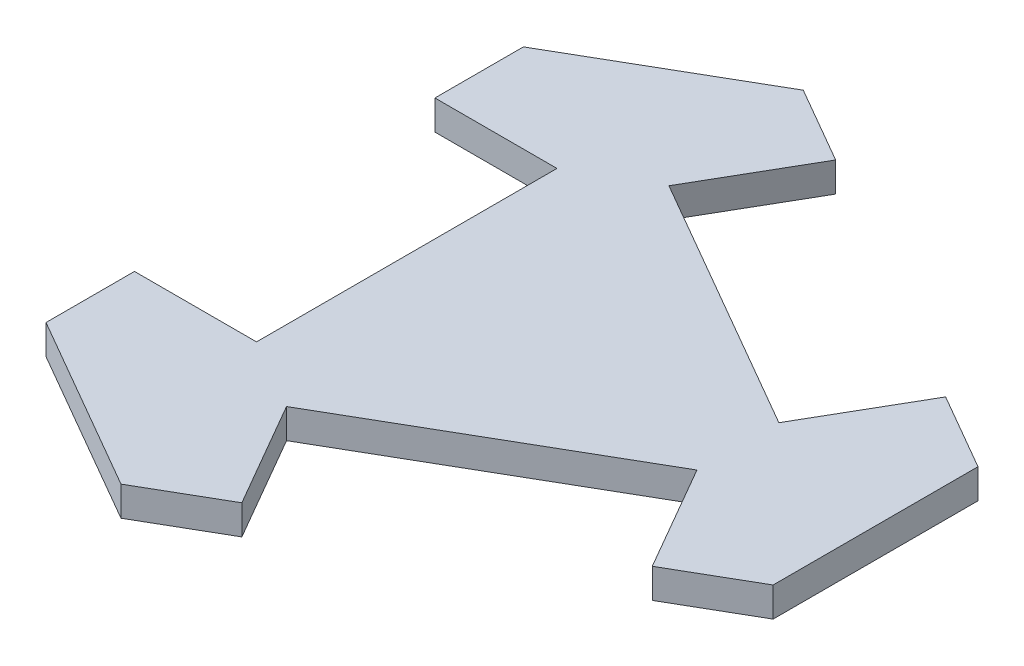
ISO-10303-21;
HEADER;
FILE_DESCRIPTION(('STEP AP214'),'2;1');
FILE_NAME('part.step','',(''),(''),'','','');
FILE_SCHEMA(('AUTOMOTIVE_DESIGN { 1 0 10303 214 1 1 1 1 }'));
ENDSEC;
DATA;
#1=APPLICATION_CONTEXT('core data for automotive mechanical design processes');
#2=APPLICATION_PROTOCOL_DEFINITION('international standard','automotive_design',2000,#1);
#3=PRODUCT_CONTEXT('',#1,'mechanical');
#4=PRODUCT('Part','Part','',(#3));
#5=PRODUCT_RELATED_PRODUCT_CATEGORY('part','',(#4));
#6=PRODUCT_DEFINITION_FORMATION('','',#4);
#7=PRODUCT_DEFINITION_CONTEXT('part definition',#1,'design');
#8=PRODUCT_DEFINITION('design','',#6,#7);
#9=PRODUCT_DEFINITION_SHAPE('','',#8);
#10=(LENGTH_UNIT() NAMED_UNIT(*) SI_UNIT(.MILLI.,.METRE.));
#11=(NAMED_UNIT(*) PLANE_ANGLE_UNIT() SI_UNIT($,.RADIAN.));
#12=(NAMED_UNIT(*) SI_UNIT($,.STERADIAN.) SOLID_ANGLE_UNIT());
#13=UNCERTAINTY_MEASURE_WITH_UNIT(LENGTH_MEASURE(1.E-05),#10,'distance_accuracy_value','');
#14=(GEOMETRIC_REPRESENTATION_CONTEXT(3) GLOBAL_UNCERTAINTY_ASSIGNED_CONTEXT((#13)) GLOBAL_UNIT_ASSIGNED_CONTEXT((#10,
#11,#12)) REPRESENTATION_CONTEXT('',''));
#15=CARTESIAN_POINT('',(0.,0.,0.));
#16=DIRECTION('',(0.,0.,1.));
#17=DIRECTION('',(1.,0.,0.));
#18=AXIS2_PLACEMENT_3D('',#15,#16,#17);
#19=CARTESIAN_POINT('',(-86.6025403784434,10.,-80.7179676972441));
#20=DIRECTION('',(1.,0.,0.));
#21=DIRECTION('',(0.,0.,-1.));
#22=AXIS2_PLACEMENT_3D('',#19,#20,#21);
#23=PLANE('',#22);
#24=DIRECTION('',(0.,0.,1.));
#25=VECTOR('',#24,1.);
#26=CARTESIAN_POINT('',(-86.6025403784434,0.,-80.7179676972441));
#27=LINE('',#26,#25);
#28=CARTESIAN_POINT('',(-86.6025403784434,0.,-80.7179676972441));
#29=VERTEX_POINT('',#28);
#30=CARTESIAN_POINT('',(-86.6025403784434,0.,-50.8));
#31=VERTEX_POINT('',#30);
#32=EDGE_CURVE('E206',#29,#31,#27,.T.);
#33=ORIENTED_EDGE('',*,*,#32,.T.);
#34=DIRECTION('',(0.,-1.,0.));
#35=VECTOR('',#34,1.);
#36=CARTESIAN_POINT('',(-86.6025403784434,10.,-50.8));
#37=LINE('',#36,#35);
#38=CARTESIAN_POINT('',(-86.6025403784434,10.,-50.8));
#39=VERTEX_POINT('',#38);
#40=EDGE_CURVE('E11',#39,#31,#37,.T.);
#41=ORIENTED_EDGE('',*,*,#40,.F.);
#42=DIRECTION('',(0.,0.,1.));
#43=VECTOR('',#42,1.);
#44=CARTESIAN_POINT('',(-86.6025403784434,10.,-80.7179676972441));
#45=LINE('',#44,#43);
#46=CARTESIAN_POINT('',(-86.6025403784434,10.,-80.7179676972441));
#47=VERTEX_POINT('',#46);
#48=EDGE_CURVE('E258',#47,#39,#45,.T.);
#49=ORIENTED_EDGE('',*,*,#48,.F.);
#50=DIRECTION('',(0.,-1.,0.));
#51=VECTOR('',#50,1.);
#52=CARTESIAN_POINT('',(-86.6025403784434,10.,-80.7179676972441));
#53=LINE('',#52,#51);
#54=EDGE_CURVE('E202',#47,#29,#53,.T.);
#55=ORIENTED_EDGE('',*,*,#54,.T.);
#56=EDGE_LOOP('',(#33,#41,#49,#55));
#57=FACE_BOUND('',#56,.T.);
#58=ADVANCED_FACE('F45',(#57),#23,.F.);
#59=CARTESIAN_POINT('',(-45.3275403784432,10.,-50.8));
#60=DIRECTION('',(0.,0.,-1.));
#61=DIRECTION('',(-1.,0.,0.));
#62=AXIS2_PLACEMENT_3D('',#59,#60,#61);
#63=PLANE('',#62);
#64=DIRECTION('',(1.,0.,0.));
#65=VECTOR('',#64,1.);
#66=CARTESIAN_POINT('',(-45.3275403784432,0.,-50.8));
#67=LINE('',#66,#65);
#68=CARTESIAN_POINT('',(-45.3275403784432,0.,-50.8));
#69=VERTEX_POINT('',#68);
#70=EDGE_CURVE('E210',#31,#69,#67,.T.);
#71=ORIENTED_EDGE('',*,*,#70,.T.);
#72=DIRECTION('',(0.,-1.,0.));
#73=VECTOR('',#72,1.);
#74=CARTESIAN_POINT('',(-45.3275403784432,10.,-50.8));
#75=LINE('',#74,#73);
#76=CARTESIAN_POINT('',(-45.3275403784432,10.,-50.8));
#77=VERTEX_POINT('',#76);
#78=EDGE_CURVE('E54',#77,#69,#75,.T.);
#79=ORIENTED_EDGE('',*,*,#78,.F.);
#80=DIRECTION('',(1.,0.,0.));
#81=VECTOR('',#80,1.);
#82=CARTESIAN_POINT('',(-45.3275403784432,10.,-50.8));
#83=LINE('',#82,#81);
#84=EDGE_CURVE('E135',#39,#77,#83,.T.);
#85=ORIENTED_EDGE('',*,*,#84,.F.);
#86=ORIENTED_EDGE('',*,*,#40,.T.);
#87=EDGE_LOOP('',(#71,#79,#85,#86));
#88=FACE_BOUND('',#87,.T.);
#89=ADVANCED_FACE('F394',(#88),#63,.F.);
#90=CARTESIAN_POINT('',(-45.3275403784432,10.,50.8));
#91=DIRECTION('',(1.,0.,0.));
#92=DIRECTION('',(0.,0.,-1.));
#93=AXIS2_PLACEMENT_3D('',#90,#91,#92);
#94=PLANE('',#93);
#95=DIRECTION('',(0.,0.,1.));
#96=VECTOR('',#95,1.);
#97=CARTESIAN_POINT('',(-45.3275403784432,0.,50.8));
#98=LINE('',#97,#96);
#99=CARTESIAN_POINT('',(-45.3275403784432,0.,50.8));
#100=VERTEX_POINT('',#99);
#101=EDGE_CURVE('E213',#69,#100,#98,.T.);
#102=ORIENTED_EDGE('',*,*,#101,.T.);
#103=DIRECTION('',(0.,-1.,0.));
#104=VECTOR('',#103,1.);
#105=CARTESIAN_POINT('',(-45.3275403784432,10.,50.8));
#106=LINE('',#105,#104);
#107=CARTESIAN_POINT('',(-45.3275403784432,10.,50.8));
#108=VERTEX_POINT('',#107);
#109=EDGE_CURVE('E309',#108,#100,#106,.T.);
#110=ORIENTED_EDGE('',*,*,#109,.F.);
#111=DIRECTION('',(0.,0.,1.));
#112=VECTOR('',#111,1.);
#113=CARTESIAN_POINT('',(-45.3275403784432,10.,50.8));
#114=LINE('',#113,#112);
#115=EDGE_CURVE('E319',#77,#108,#114,.T.);
#116=ORIENTED_EDGE('',*,*,#115,.F.);
#117=ORIENTED_EDGE('',*,*,#78,.T.);
#118=EDGE_LOOP('',(#102,#110,#116,#117));
#119=FACE_BOUND('',#118,.T.);
#120=ADVANCED_FACE('F317',(#119),#94,.F.);
#121=CARTESIAN_POINT('',(-45.3275403784432,10.,50.8));
#122=DIRECTION('',(0.,0.,1.));
#123=DIRECTION('',(1.,0.,0.));
#124=AXIS2_PLACEMENT_3D('',#121,#122,#123);
#125=PLANE('',#124);
#126=DIRECTION('',(-1.,0.,0.));
#127=VECTOR('',#126,1.);
#128=CARTESIAN_POINT('',(-45.3275403784432,0.,50.8));
#129=LINE('',#128,#127);
#130=CARTESIAN_POINT('',(-86.6025403784433,0.,50.8));
#131=VERTEX_POINT('',#130);
#132=EDGE_CURVE('E216',#100,#131,#129,.T.);
#133=ORIENTED_EDGE('',*,*,#132,.T.);
#134=DIRECTION('',(0.,-1.,0.));
#135=VECTOR('',#134,1.);
#136=CARTESIAN_POINT('',(-86.6025403784433,10.,50.8));
#137=LINE('',#136,#135);
#138=CARTESIAN_POINT('',(-86.6025403784433,10.,50.8));
#139=VERTEX_POINT('',#138);
#140=EDGE_CURVE('E305',#139,#131,#137,.T.);
#141=ORIENTED_EDGE('',*,*,#140,.F.);
#142=DIRECTION('',(-1.,0.,0.));
#143=VECTOR('',#142,1.);
#144=CARTESIAN_POINT('',(-45.3275403784432,10.,50.8));
#145=LINE('',#144,#143);
#146=EDGE_CURVE('E338',#108,#139,#145,.T.);
#147=ORIENTED_EDGE('',*,*,#146,.F.);
#148=ORIENTED_EDGE('',*,*,#109,.T.);
#149=EDGE_LOOP('',(#133,#141,#147,#148));
#150=FACE_BOUND('',#149,.T.);
#151=ADVANCED_FACE('F328',(#150),#125,.F.);
#152=CARTESIAN_POINT('',(-86.6025403784434,10.,80.717967697244));
#153=DIRECTION('',(1.,0.,0.));
#154=DIRECTION('',(0.,0.,-1.));
#155=AXIS2_PLACEMENT_3D('',#152,#153,#154);
#156=PLANE('',#155);
#157=DIRECTION('',(0.,0.,1.));
#158=VECTOR('',#157,1.);
#159=CARTESIAN_POINT('',(-86.6025403784434,0.,80.717967697244));
#160=LINE('',#159,#158);
#161=CARTESIAN_POINT('',(-86.6025403784434,0.,80.717967697244));
#162=VERTEX_POINT('',#161);
#163=EDGE_CURVE('E219',#131,#162,#160,.T.);
#164=ORIENTED_EDGE('',*,*,#163,.T.);
#165=DIRECTION('',(0.,-1.,0.));
#166=VECTOR('',#165,1.);
#167=CARTESIAN_POINT('',(-86.6025403784434,10.,80.717967697244));
#168=LINE('',#167,#166);
#169=CARTESIAN_POINT('',(-86.6025403784434,10.,80.717967697244));
#170=VERTEX_POINT('',#169);
#171=EDGE_CURVE('E301',#170,#162,#168,.T.);
#172=ORIENTED_EDGE('',*,*,#171,.F.);
#173=DIRECTION('',(0.,0.,1.));
#174=VECTOR('',#173,1.);
#175=CARTESIAN_POINT('',(-86.6025403784434,10.,80.717967697244));
#176=LINE('',#175,#174);
#177=EDGE_CURVE('E334',#139,#170,#176,.T.);
#178=ORIENTED_EDGE('',*,*,#177,.F.);
#179=ORIENTED_EDGE('',*,*,#140,.T.);
#180=EDGE_LOOP('',(#164,#172,#178,#179));
#181=FACE_BOUND('',#180,.T.);
#182=ADVANCED_FACE('F332',(#181),#156,.F.);
#183=CARTESIAN_POINT('',(-86.6025403784434,10.,80.717967697244));
#184=DIRECTION('',(0.5,0.,-0.866025403784438));
#185=DIRECTION('',(-0.866025403784439,0.,-0.5));
#186=AXIS2_PLACEMENT_3D('',#183,#184,#185);
#187=PLANE('',#186);
#188=DIRECTION('',(0.866025403784439,0.,0.5));
#189=VECTOR('',#188,1.);
#190=CARTESIAN_POINT('',(-86.6025403784434,0.,80.717967697244));
#191=LINE('',#190,#189);
#192=CARTESIAN_POINT('',(-26.6025403784433,0.,115.358983848622));
#193=VERTEX_POINT('',#192);
#194=EDGE_CURVE('E222',#162,#193,#191,.T.);
#195=ORIENTED_EDGE('',*,*,#194,.T.);
#196=DIRECTION('',(0.,-1.,0.));
#197=VECTOR('',#196,1.);
#198=CARTESIAN_POINT('',(-26.6025403784433,10.,115.358983848622));
#199=LINE('',#198,#197);
#200=CARTESIAN_POINT('',(-26.6025403784433,10.,115.358983848622));
#201=VERTEX_POINT('',#200);
#202=EDGE_CURVE('E297',#201,#193,#199,.T.);
#203=ORIENTED_EDGE('',*,*,#202,.F.);
#204=DIRECTION('',(0.866025403784439,0.,0.5));
#205=VECTOR('',#204,1.);
#206=CARTESIAN_POINT('',(-86.6025403784434,10.,80.717967697244));
#207=LINE('',#206,#205);
#208=EDGE_CURVE('E337',#170,#201,#207,.T.);
#209=ORIENTED_EDGE('',*,*,#208,.F.);
#210=ORIENTED_EDGE('',*,*,#171,.T.);
#211=EDGE_LOOP('',(#195,#203,#209,#210));
#212=FACE_BOUND('',#211,.T.);
#213=ADVANCED_FACE('F407',(#212),#187,.F.);
#214=CARTESIAN_POINT('',(-26.6025403784433,10.,115.358983848622));
#215=DIRECTION('',(-0.499999999999987,0.,-0.866025403784446));
#216=DIRECTION('',(-0.866025403784446,0.,0.499999999999987));
#217=AXIS2_PLACEMENT_3D('',#214,#215,#216);
#218=PLANE('',#217);
#219=DIRECTION('',(0.866025403784446,0.,-0.499999999999987));
#220=VECTOR('',#219,1.);
#221=CARTESIAN_POINT('',(-26.6025403784433,0.,115.358983848622));
#222=LINE('',#221,#220);
#223=CARTESIAN_POINT('',(-0.692820323026935,0.,100.4));
#224=VERTEX_POINT('',#223);
#225=EDGE_CURVE('E225',#193,#224,#222,.T.);
#226=ORIENTED_EDGE('',*,*,#225,.T.);
#227=DIRECTION('',(0.,-1.,0.));
#228=VECTOR('',#227,1.);
#229=CARTESIAN_POINT('',(-0.692820323026935,10.,100.4));
#230=LINE('',#229,#228);
#231=CARTESIAN_POINT('',(-0.692820323026935,10.,100.4));
#232=VERTEX_POINT('',#231);
#233=EDGE_CURVE('E293',#232,#224,#230,.T.);
#234=ORIENTED_EDGE('',*,*,#233,.F.);
#235=DIRECTION('',(0.866025403784446,0.,-0.499999999999987));
#236=VECTOR('',#235,1.);
#237=CARTESIAN_POINT('',(-26.6025403784433,10.,115.358983848622));
#238=LINE('',#237,#236);
#239=EDGE_CURVE('E342',#201,#232,#238,.T.);
#240=ORIENTED_EDGE('',*,*,#239,.F.);
#241=ORIENTED_EDGE('',*,*,#202,.T.);
#242=EDGE_LOOP('',(#226,#234,#240,#241));
#243=FACE_BOUND('',#242,.T.);
#244=ADVANCED_FACE('F410',(#243),#218,.F.);
#245=CARTESIAN_POINT('',(-21.3303203230273,10.,64.6548014587969));
#246=DIRECTION('',(-0.866025403784434,0.,0.500000000000007));
#247=DIRECTION('',(0.500000000000008,0.,0.866025403784434));
#248=AXIS2_PLACEMENT_3D('',#245,#246,#247);
#249=PLANE('',#248);
#250=DIRECTION('',(-0.500000000000007,0.,-0.866025403784434));
#251=VECTOR('',#250,1.);
#252=CARTESIAN_POINT('',(-21.3303203230273,0.,64.6548014587969));
#253=LINE('',#252,#251);
#254=CARTESIAN_POINT('',(-21.3303203230273,0.,64.6548014587969));
#255=VERTEX_POINT('',#254);
#256=EDGE_CURVE('E228',#224,#255,#253,.T.);
#257=ORIENTED_EDGE('',*,*,#256,.T.);
#258=DIRECTION('',(0.,-1.,0.));
#259=VECTOR('',#258,1.);
#260=CARTESIAN_POINT('',(-21.3303203230273,10.,64.6548014587969));
#261=LINE('',#260,#259);
#262=CARTESIAN_POINT('',(-21.3303203230273,10.,64.6548014587969));
#263=VERTEX_POINT('',#262);
#264=EDGE_CURVE('E289',#263,#255,#261,.T.);
#265=ORIENTED_EDGE('',*,*,#264,.F.);
#266=DIRECTION('',(-0.500000000000007,0.,-0.866025403784434));
#267=VECTOR('',#266,1.);
#268=CARTESIAN_POINT('',(-21.3303203230273,10.,64.6548014587969));
#269=LINE('',#268,#267);
#270=EDGE_CURVE('E349',#232,#263,#269,.T.);
#271=ORIENTED_EDGE('',*,*,#270,.F.);
#272=ORIENTED_EDGE('',*,*,#233,.T.);
#273=EDGE_LOOP('',(#257,#265,#271,#272));
#274=FACE_BOUND('',#273,.T.);
#275=ADVANCED_FACE('F414',(#274),#249,.F.);
#276=CARTESIAN_POINT('',(-21.3303203230273,10.,64.6548014587969));
#277=DIRECTION('',(-0.500000000000007,0.,-0.866025403784434));
#278=DIRECTION('',(-0.866025403784434,0.,0.500000000000007));
#279=AXIS2_PLACEMENT_3D('',#276,#277,#278);
#280=PLANE('',#279);
#281=DIRECTION('',(0.866025403784434,0.,-0.500000000000007));
#282=VECTOR('',#281,1.);
#283=CARTESIAN_POINT('',(-21.3303203230273,0.,64.6548014587969));
#284=LINE('',#283,#282);
#285=CARTESIAN_POINT('',(66.6578607014712,0.,13.8548014587961));
#286=VERTEX_POINT('',#285);
#287=EDGE_CURVE('E231',#255,#286,#284,.T.);
#288=ORIENTED_EDGE('',*,*,#287,.T.);
#289=DIRECTION('',(0.,-1.,0.));
#290=VECTOR('',#289,1.);
#291=CARTESIAN_POINT('',(66.6578607014712,10.,13.8548014587961));
#292=LINE('',#291,#290);
#293=CARTESIAN_POINT('',(66.6578607014712,10.,13.8548014587961));
#294=VERTEX_POINT('',#293);
#295=EDGE_CURVE('E285',#294,#286,#292,.T.);
#296=ORIENTED_EDGE('',*,*,#295,.F.);
#297=DIRECTION('',(0.866025403784434,0.,-0.500000000000007));
#298=VECTOR('',#297,1.);
#299=CARTESIAN_POINT('',(-21.3303203230273,10.,64.6548014587969));
#300=LINE('',#299,#298);
#301=EDGE_CURVE('E352',#263,#294,#300,.T.);
#302=ORIENTED_EDGE('',*,*,#301,.F.);
#303=ORIENTED_EDGE('',*,*,#264,.T.);
#304=EDGE_LOOP('',(#288,#296,#302,#303));
#305=FACE_BOUND('',#304,.T.);
#306=ADVANCED_FACE('F418',(#305),#280,.F.);
#307=CARTESIAN_POINT('',(66.6578607014712,10.,13.8548014587961));
#308=DIRECTION('',(0.866025403784434,0.,-0.500000000000007));
#309=DIRECTION('',(-0.500000000000007,0.,-0.866025403784435));
#310=AXIS2_PLACEMENT_3D('',#307,#308,#309);
#311=PLANE('',#310);
#312=DIRECTION('',(0.500000000000007,0.,0.866025403784435));
#313=VECTOR('',#312,1.);
#314=CARTESIAN_POINT('',(66.6578607014712,0.,13.8548014587961));
#315=LINE('',#314,#313);
#316=CARTESIAN_POINT('',(87.2953607014716,0.,49.5999999999988));
#317=VERTEX_POINT('',#316);
#318=EDGE_CURVE('E234',#286,#317,#315,.T.);
#319=ORIENTED_EDGE('',*,*,#318,.T.);
#320=DIRECTION('',(0.,-1.,0.));
#321=VECTOR('',#320,1.);
#322=CARTESIAN_POINT('',(87.2953607014716,10.,49.5999999999988));
#323=LINE('',#322,#321);
#324=CARTESIAN_POINT('',(87.2953607014716,10.,49.5999999999988));
#325=VERTEX_POINT('',#324);
#326=EDGE_CURVE('E281',#325,#317,#323,.T.);
#327=ORIENTED_EDGE('',*,*,#326,.F.);
#328=DIRECTION('',(0.500000000000007,0.,0.866025403784435));
#329=VECTOR('',#328,1.);
#330=CARTESIAN_POINT('',(66.6578607014712,10.,13.8548014587961));
#331=LINE('',#330,#329);
#332=EDGE_CURVE('E355',#294,#325,#331,.T.);
#333=ORIENTED_EDGE('',*,*,#332,.F.);
#334=ORIENTED_EDGE('',*,*,#295,.T.);
#335=EDGE_LOOP('',(#319,#327,#333,#334));
#336=FACE_BOUND('',#335,.T.);
#337=ADVANCED_FACE('F422',(#336),#311,.F.);
#338=CARTESIAN_POINT('',(87.2953607014716,10.,49.5999999999988));
#339=DIRECTION('',(-0.499999999999988,0.,-0.866025403784446));
#340=DIRECTION('',(-0.866025403784446,0.,0.499999999999988));
#341=AXIS2_PLACEMENT_3D('',#338,#339,#340);
#342=PLANE('',#341);
#343=DIRECTION('',(0.866025403784446,0.,-0.499999999999988));
#344=VECTOR('',#343,1.);
#345=CARTESIAN_POINT('',(87.2953607014716,0.,49.5999999999988));
#346=LINE('',#345,#344);
#347=CARTESIAN_POINT('',(113.205080756887,0.,34.6410161513775));
#348=VERTEX_POINT('',#347);
#349=EDGE_CURVE('E237',#317,#348,#346,.T.);
#350=ORIENTED_EDGE('',*,*,#349,.T.);
#351=DIRECTION('',(0.,-1.,0.));
#352=VECTOR('',#351,1.);
#353=CARTESIAN_POINT('',(113.205080756887,10.,34.6410161513775));
#354=LINE('',#353,#352);
#355=CARTESIAN_POINT('',(113.205080756887,10.,34.6410161513775));
#356=VERTEX_POINT('',#355);
#357=EDGE_CURVE('E277',#356,#348,#354,.T.);
#358=ORIENTED_EDGE('',*,*,#357,.F.);
#359=DIRECTION('',(0.866025403784446,0.,-0.499999999999988));
#360=VECTOR('',#359,1.);
#361=CARTESIAN_POINT('',(87.2953607014716,10.,49.5999999999988));
#362=LINE('',#361,#360);
#363=EDGE_CURVE('E358',#325,#356,#362,.T.);
#364=ORIENTED_EDGE('',*,*,#363,.F.);
#365=ORIENTED_EDGE('',*,*,#326,.T.);
#366=EDGE_LOOP('',(#350,#358,#364,#365));
#367=FACE_BOUND('',#366,.T.);
#368=ADVANCED_FACE('F426',(#367),#342,.F.);
#369=CARTESIAN_POINT('',(113.205080756887,10.,34.6410161513775));
#370=DIRECTION('',(-1.,0.,0.));
#371=DIRECTION('',(0.,0.,1.));
#372=AXIS2_PLACEMENT_3D('',#369,#370,#371);
#373=PLANE('',#372);
#374=DIRECTION('',(0.,0.,-1.));
#375=VECTOR('',#374,1.);
#376=CARTESIAN_POINT('',(113.205080756887,0.,34.6410161513775));
#377=LINE('',#376,#375);
#378=CARTESIAN_POINT('',(113.205080756887,0.,-34.6410161513775));
#379=VERTEX_POINT('',#378);
#380=EDGE_CURVE('E240',#348,#379,#377,.T.);
#381=ORIENTED_EDGE('',*,*,#380,.T.);
#382=DIRECTION('',(0.,-1.,0.));
#383=VECTOR('',#382,1.);
#384=CARTESIAN_POINT('',(113.205080756887,10.,-34.6410161513775));
#385=LINE('',#384,#383);
#386=CARTESIAN_POINT('',(113.205080756887,10.,-34.6410161513775));
#387=VERTEX_POINT('',#386);
#388=EDGE_CURVE('E273',#387,#379,#385,.T.);
#389=ORIENTED_EDGE('',*,*,#388,.F.);
#390=DIRECTION('',(0.,0.,-1.));
#391=VECTOR('',#390,1.);
#392=CARTESIAN_POINT('',(113.205080756887,10.,34.6410161513775));
#393=LINE('',#392,#391);
#394=EDGE_CURVE('E361',#356,#387,#393,.T.);
#395=ORIENTED_EDGE('',*,*,#394,.F.);
#396=ORIENTED_EDGE('',*,*,#357,.T.);
#397=EDGE_LOOP('',(#381,#389,#395,#396));
#398=FACE_BOUND('',#397,.T.);
#399=ADVANCED_FACE('F430',(#398),#373,.F.);
#400=CARTESIAN_POINT('',(113.205080756887,10.,-34.6410161513775));
#401=DIRECTION('',(-0.500000000000014,0.,0.86602540378443));
#402=DIRECTION('',(0.86602540378443,0.,0.500000000000014));
#403=AXIS2_PLACEMENT_3D('',#400,#401,#402);
#404=PLANE('',#403);
#405=DIRECTION('',(-0.86602540378443,0.,-0.500000000000014));
#406=VECTOR('',#405,1.);
#407=CARTESIAN_POINT('',(113.205080756887,0.,-34.6410161513775));
#408=LINE('',#407,#406);
#409=CARTESIAN_POINT('',(87.2953607014707,0.,-49.6000000000004));
#410=VERTEX_POINT('',#409);
#411=EDGE_CURVE('E243',#379,#410,#408,.T.);
#412=ORIENTED_EDGE('',*,*,#411,.T.);
#413=DIRECTION('',(0.,-1.,0.));
#414=VECTOR('',#413,1.);
#415=CARTESIAN_POINT('',(87.2953607014707,10.,-49.6000000000004));
#416=LINE('',#415,#414);
#417=CARTESIAN_POINT('',(87.2953607014707,10.,-49.6000000000004));
#418=VERTEX_POINT('',#417);
#419=EDGE_CURVE('E269',#418,#410,#416,.T.);
#420=ORIENTED_EDGE('',*,*,#419,.F.);
#421=DIRECTION('',(-0.86602540378443,0.,-0.500000000000014));
#422=VECTOR('',#421,1.);
#423=CARTESIAN_POINT('',(113.205080756887,10.,-34.6410161513775));
#424=LINE('',#423,#422);
#425=EDGE_CURVE('E364',#387,#418,#424,.T.);
#426=ORIENTED_EDGE('',*,*,#425,.F.);
#427=ORIENTED_EDGE('',*,*,#388,.T.);
#428=EDGE_LOOP('',(#412,#420,#426,#427));
#429=FACE_BOUND('',#428,.T.);
#430=ADVANCED_FACE('F434',(#429),#404,.F.);
#431=CARTESIAN_POINT('',(66.6578607014709,10.,-13.8548014587973));
#432=DIRECTION('',(0.866025403784443,0.,0.499999999999992));
#433=DIRECTION('',(0.499999999999992,0.,-0.866025403784443));
#434=AXIS2_PLACEMENT_3D('',#431,#432,#433);
#435=PLANE('',#434);
#436=DIRECTION('',(-0.499999999999992,0.,0.866025403784443));
#437=VECTOR('',#436,1.);
#438=CARTESIAN_POINT('',(66.6578607014709,0.,-13.8548014587973));
#439=LINE('',#438,#437);
#440=CARTESIAN_POINT('',(66.6578607014709,0.,-13.8548014587973));
#441=VERTEX_POINT('',#440);
#442=EDGE_CURVE('E246',#410,#441,#439,.T.);
#443=ORIENTED_EDGE('',*,*,#442,.T.);
#444=DIRECTION('',(0.,-1.,0.));
#445=VECTOR('',#444,1.);
#446=CARTESIAN_POINT('',(66.6578607014709,10.,-13.8548014587973));
#447=LINE('',#446,#445);
#448=CARTESIAN_POINT('',(66.6578607014709,10.,-13.8548014587973));
#449=VERTEX_POINT('',#448);
#450=EDGE_CURVE('E265',#449,#441,#447,.T.);
#451=ORIENTED_EDGE('',*,*,#450,.F.);
#452=DIRECTION('',(-0.499999999999992,0.,0.866025403784443));
#453=VECTOR('',#452,1.);
#454=CARTESIAN_POINT('',(66.6578607014709,10.,-13.8548014587973));
#455=LINE('',#454,#453);
#456=EDGE_CURVE('E367',#418,#449,#455,.T.);
#457=ORIENTED_EDGE('',*,*,#456,.F.);
#458=ORIENTED_EDGE('',*,*,#419,.T.);
#459=EDGE_LOOP('',(#443,#451,#457,#458));
#460=FACE_BOUND('',#459,.T.);
#461=ADVANCED_FACE('F375',(#460),#435,.F.);
#462=CARTESIAN_POINT('',(66.6578607014709,10.,-13.8548014587973));
#463=DIRECTION('',(-0.499999999999992,0.,0.866025403784443));
#464=DIRECTION('',(0.866025403784443,0.,0.499999999999992));
#465=AXIS2_PLACEMENT_3D('',#462,#463,#464);
#466=PLANE('',#465);
#467=DIRECTION('',(-0.866025403784443,0.,-0.499999999999992));
#468=VECTOR('',#467,1.);
#469=CARTESIAN_POINT('',(66.6578607014709,0.,-13.8548014587973));
#470=LINE('',#469,#468);
#471=CARTESIAN_POINT('',(-21.3303203230285,0.,-64.6548014587965));
#472=VERTEX_POINT('',#471);
#473=EDGE_CURVE('E249',#441,#472,#470,.T.);
#474=ORIENTED_EDGE('',*,*,#473,.T.);
#475=DIRECTION('',(0.,-1.,0.));
#476=VECTOR('',#475,1.);
#477=CARTESIAN_POINT('',(-21.3303203230285,10.,-64.6548014587965));
#478=LINE('',#477,#476);
#479=CARTESIAN_POINT('',(-21.3303203230285,10.,-64.6548014587965));
#480=VERTEX_POINT('',#479);
#481=EDGE_CURVE('E195',#480,#472,#478,.T.);
#482=ORIENTED_EDGE('',*,*,#481,.F.);
#483=DIRECTION('',(-0.866025403784443,0.,-0.499999999999992));
#484=VECTOR('',#483,1.);
#485=CARTESIAN_POINT('',(66.6578607014709,10.,-13.8548014587973));
#486=LINE('',#485,#484);
#487=EDGE_CURVE('E184',#449,#480,#486,.T.);
#488=ORIENTED_EDGE('',*,*,#487,.F.);
#489=ORIENTED_EDGE('',*,*,#450,.T.);
#490=EDGE_LOOP('',(#474,#482,#488,#489));
#491=FACE_BOUND('',#490,.T.);
#492=ADVANCED_FACE('F379',(#491),#466,.F.);
#493=CARTESIAN_POINT('',(-21.3303203230285,10.,-64.6548014587965));
#494=DIRECTION('',(-0.866025403784443,0.,-0.499999999999992));
#495=DIRECTION('',(-0.499999999999992,0.,0.866025403784443));
#496=AXIS2_PLACEMENT_3D('',#493,#494,#495);
#497=PLANE('',#496);
#498=DIRECTION('',(0.499999999999992,0.,-0.866025403784443));
#499=VECTOR('',#498,1.);
#500=CARTESIAN_POINT('',(-21.3303203230285,0.,-64.6548014587965));
#501=LINE('',#500,#499);
#502=CARTESIAN_POINT('',(-0.692820323028739,0.,-100.4));
#503=VERTEX_POINT('',#502);
#504=EDGE_CURVE('E193',#472,#503,#501,.T.);
#505=ORIENTED_EDGE('',*,*,#504,.T.);
#506=DIRECTION('',(0.,-1.,0.));
#507=VECTOR('',#506,1.);
#508=CARTESIAN_POINT('',(-0.692820323028739,10.,-100.4));
#509=LINE('',#508,#507);
#510=CARTESIAN_POINT('',(-0.692820323028739,10.,-100.4));
#511=VERTEX_POINT('',#510);
#512=EDGE_CURVE('E190',#511,#503,#509,.T.);
#513=ORIENTED_EDGE('',*,*,#512,.F.);
#514=DIRECTION('',(0.499999999999992,0.,-0.866025403784443));
#515=VECTOR('',#514,1.);
#516=CARTESIAN_POINT('',(-21.3303203230285,10.,-64.6548014587965));
#517=LINE('',#516,#515);
#518=EDGE_CURVE('E178',#480,#511,#517,.T.);
#519=ORIENTED_EDGE('',*,*,#518,.F.);
#520=ORIENTED_EDGE('',*,*,#481,.T.);
#521=EDGE_LOOP('',(#505,#513,#519,#520));
#522=FACE_BOUND('',#521,.T.);
#523=ADVANCED_FACE('F191',(#522),#497,.F.);
#524=CARTESIAN_POINT('',(-0.692820323028739,10.,-100.4));
#525=DIRECTION('',(-0.500000000000014,0.,0.86602540378443));
#526=DIRECTION('',(0.86602540378443,0.,0.500000000000014));
#527=AXIS2_PLACEMENT_3D('',#524,#525,#526);
#528=PLANE('',#527);
#529=DIRECTION('',(-0.86602540378443,0.,-0.500000000000014));
#530=VECTOR('',#529,1.);
#531=CARTESIAN_POINT('',(-0.692820323028739,0.,-100.4));
#532=LINE('',#531,#530);
#533=CARTESIAN_POINT('',(-26.6025403784433,0.,-115.358983848622));
#534=VERTEX_POINT('',#533);
#535=EDGE_CURVE('E121',#503,#534,#532,.T.);
#536=ORIENTED_EDGE('',*,*,#535,.T.);
#537=DIRECTION('',(0.,-1.,0.));
#538=VECTOR('',#537,1.);
#539=CARTESIAN_POINT('',(-26.6025403784433,10.,-115.358983848622));
#540=LINE('',#539,#538);
#541=CARTESIAN_POINT('',(-26.6025403784433,10.,-115.358983848622));
#542=VERTEX_POINT('',#541);
#543=EDGE_CURVE('E196',#542,#534,#540,.T.);
#544=ORIENTED_EDGE('',*,*,#543,.F.);
#545=DIRECTION('',(-0.86602540378443,0.,-0.500000000000014));
#546=VECTOR('',#545,1.);
#547=CARTESIAN_POINT('',(-0.692820323028739,10.,-100.4));
#548=LINE('',#547,#546);
#549=EDGE_CURVE('E182',#511,#542,#548,.T.);
#550=ORIENTED_EDGE('',*,*,#549,.F.);
#551=ORIENTED_EDGE('',*,*,#512,.T.);
#552=EDGE_LOOP('',(#536,#544,#550,#551));
#553=FACE_BOUND('',#552,.T.);
#554=ADVANCED_FACE('F198',(#553),#528,.F.);
#555=CARTESIAN_POINT('',(-26.6025403784433,10.,-115.358983848622));
#556=DIRECTION('',(0.499999999999999,0.,0.866025403784439));
#557=DIRECTION('',(0.866025403784439,0.,-0.499999999999999));
#558=AXIS2_PLACEMENT_3D('',#555,#556,#557);
#559=PLANE('',#558);
#560=DIRECTION('',(-0.866025403784439,0.,0.499999999999999));
#561=VECTOR('',#560,1.);
#562=CARTESIAN_POINT('',(-26.6025403784433,0.,-115.358983848622));
#563=LINE('',#562,#561);
#564=EDGE_CURVE('E127',#534,#29,#563,.T.);
#565=ORIENTED_EDGE('',*,*,#564,.T.);
#566=ORIENTED_EDGE('',*,*,#54,.F.);
#567=DIRECTION('',(-0.866025403784439,0.,0.499999999999999));
#568=VECTOR('',#567,1.);
#569=CARTESIAN_POINT('',(-26.6025403784433,10.,-115.358983848622));
#570=LINE('',#569,#568);
#571=EDGE_CURVE('E62',#542,#47,#570,.T.);
#572=ORIENTED_EDGE('',*,*,#571,.F.);
#573=ORIENTED_EDGE('',*,*,#543,.T.);
#574=EDGE_LOOP('',(#565,#566,#572,#573));
#575=FACE_BOUND('',#574,.T.);
#576=ADVANCED_FACE('F383',(#575),#559,.F.);
#577=CARTESIAN_POINT('',(0.,10.,0.));
#578=DIRECTION('',(0.,-1.,0.));
#579=DIRECTION('',(0.,0.,-1.));
#580=AXIS2_PLACEMENT_3D('',#577,#578,#579);
#581=PLANE('',#580);
#582=ORIENTED_EDGE('',*,*,#48,.T.);
#583=ORIENTED_EDGE('',*,*,#84,.T.);
#584=ORIENTED_EDGE('',*,*,#115,.T.);
#585=ORIENTED_EDGE('',*,*,#146,.T.);
#586=ORIENTED_EDGE('',*,*,#177,.T.);
#587=ORIENTED_EDGE('',*,*,#208,.T.);
#588=ORIENTED_EDGE('',*,*,#239,.T.);
#589=ORIENTED_EDGE('',*,*,#270,.T.);
#590=ORIENTED_EDGE('',*,*,#301,.T.);
#591=ORIENTED_EDGE('',*,*,#332,.T.);
#592=ORIENTED_EDGE('',*,*,#363,.T.);
#593=ORIENTED_EDGE('',*,*,#394,.T.);
#594=ORIENTED_EDGE('',*,*,#425,.T.);
#595=ORIENTED_EDGE('',*,*,#456,.T.);
#596=ORIENTED_EDGE('',*,*,#487,.T.);
#597=ORIENTED_EDGE('',*,*,#518,.T.);
#598=ORIENTED_EDGE('',*,*,#549,.T.);
#599=ORIENTED_EDGE('',*,*,#571,.T.);
#600=EDGE_LOOP('',(#582,#583,#584,#585,#586,#587,#588,#589,#590,#591,#592,#593,#594,#595,#596,
#597,#598,#599));
#601=FACE_BOUND('',#600,.T.);
#602=ADVANCED_FACE('F180',(#601),#581,.F.);
#603=CARTESIAN_POINT('',(0.,0.,0.));
#604=DIRECTION('',(0.,-1.,0.));
#605=DIRECTION('',(0.,0.,-1.));
#606=AXIS2_PLACEMENT_3D('',#603,#604,#605);
#607=PLANE('',#606);
#608=ORIENTED_EDGE('',*,*,#32,.F.);
#609=ORIENTED_EDGE('',*,*,#564,.F.);
#610=ORIENTED_EDGE('',*,*,#535,.F.);
#611=ORIENTED_EDGE('',*,*,#504,.F.);
#612=ORIENTED_EDGE('',*,*,#473,.F.);
#613=ORIENTED_EDGE('',*,*,#442,.F.);
#614=ORIENTED_EDGE('',*,*,#411,.F.);
#615=ORIENTED_EDGE('',*,*,#380,.F.);
#616=ORIENTED_EDGE('',*,*,#349,.F.);
#617=ORIENTED_EDGE('',*,*,#318,.F.);
#618=ORIENTED_EDGE('',*,*,#287,.F.);
#619=ORIENTED_EDGE('',*,*,#256,.F.);
#620=ORIENTED_EDGE('',*,*,#225,.F.);
#621=ORIENTED_EDGE('',*,*,#194,.F.);
#622=ORIENTED_EDGE('',*,*,#163,.F.);
#623=ORIENTED_EDGE('',*,*,#132,.F.);
#624=ORIENTED_EDGE('',*,*,#101,.F.);
#625=ORIENTED_EDGE('',*,*,#70,.F.);
#626=EDGE_LOOP('',(#608,#609,#610,#611,#612,#613,#614,#615,#616,#617,#618,#619,#620,#621,#622,
#623,#624,#625));
#627=FACE_BOUND('',#626,.T.);
#628=ADVANCED_FACE('F323',(#627),#607,.T.);
#629=CLOSED_SHELL('',(#58,#89,#120,#151,#182,#213,#244,#275,#306,#337,#368,#399,#430,#461,#492,
#523,#554,#576,#602,#628));
#630=MANIFOLD_SOLID_BREP('B2',#629);
#631=ADVANCED_BREP_SHAPE_REPRESENTATION('',(#18,#630),#14);
#632=SHAPE_DEFINITION_REPRESENTATION(#9,#631);
ENDSEC;
END-ISO-10303-21;
